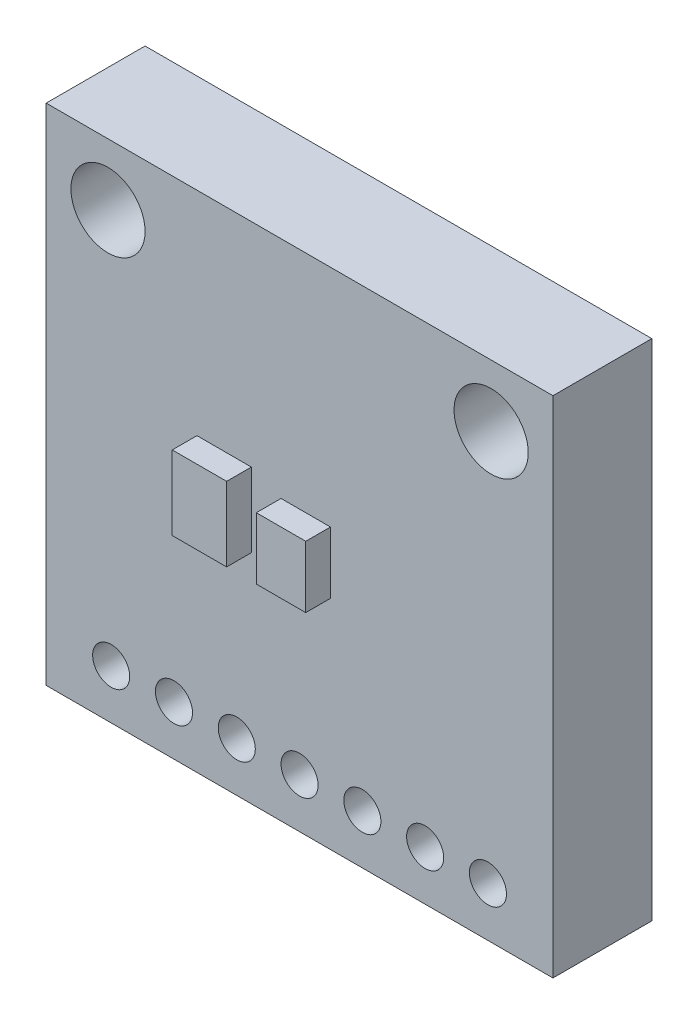
ISO-10303-21;
HEADER;
FILE_DESCRIPTION(('STEP AP214'),'2;1');
FILE_NAME('part.step','',(''),(''),'','','');
FILE_SCHEMA(('AUTOMOTIVE_DESIGN { 1 0 10303 214 1 1 1 1 }'));
ENDSEC;
DATA;
#1=APPLICATION_CONTEXT('core data for automotive mechanical design processes');
#2=APPLICATION_PROTOCOL_DEFINITION('international standard','automotive_design',2000,#1);
#3=PRODUCT_CONTEXT('',#1,'mechanical');
#4=PRODUCT('Part','Part','',(#3));
#5=PRODUCT_RELATED_PRODUCT_CATEGORY('part','',(#4));
#6=PRODUCT_DEFINITION_FORMATION('','',#4);
#7=PRODUCT_DEFINITION_CONTEXT('part definition',#1,'design');
#8=PRODUCT_DEFINITION('design','',#6,#7);
#9=PRODUCT_DEFINITION_SHAPE('','',#8);
#10=(LENGTH_UNIT() NAMED_UNIT(*) SI_UNIT(.MILLI.,.METRE.));
#11=(NAMED_UNIT(*) PLANE_ANGLE_UNIT() SI_UNIT($,.RADIAN.));
#12=(NAMED_UNIT(*) SI_UNIT($,.STERADIAN.) SOLID_ANGLE_UNIT());
#13=UNCERTAINTY_MEASURE_WITH_UNIT(LENGTH_MEASURE(1.E-05),#10,'distance_accuracy_value','');
#14=(GEOMETRIC_REPRESENTATION_CONTEXT(3) GLOBAL_UNCERTAINTY_ASSIGNED_CONTEXT((#13)) GLOBAL_UNIT_ASSIGNED_CONTEXT((#10,
#11,#12)) REPRESENTATION_CONTEXT('',''));
#15=CARTESIAN_POINT('',(0.,0.,0.));
#16=DIRECTION('',(0.,0.,1.));
#17=DIRECTION('',(1.,0.,0.));
#18=AXIS2_PLACEMENT_3D('',#15,#16,#17);
#19=CARTESIAN_POINT('',(0.,0.,0.));
#20=DIRECTION('',(0.,0.,-1.));
#21=DIRECTION('',(-1.,0.,0.));
#22=AXIS2_PLACEMENT_3D('',#19,#20,#21);
#23=PLANE('',#22);
#24=DIRECTION('',(0.,-1.,0.));
#25=VECTOR('',#24,1.);
#26=CARTESIAN_POINT('',(6.1,11.8,0.));
#27=LINE('',#26,#25);
#28=CARTESIAN_POINT('',(6.1,11.8,0.));
#29=VERTEX_POINT('',#28);
#30=CARTESIAN_POINT('',(6.1,8.8,0.));
#31=VERTEX_POINT('',#30);
#32=EDGE_CURVE('E144',#29,#31,#27,.T.);
#33=ORIENTED_EDGE('',*,*,#32,.F.);
#34=DIRECTION('',(-1.,0.,0.));
#35=VECTOR('',#34,1.);
#36=CARTESIAN_POINT('',(6.1,11.8,0.));
#37=LINE('',#36,#35);
#38=CARTESIAN_POINT('',(8.3,11.8,0.));
#39=VERTEX_POINT('',#38);
#40=EDGE_CURVE('E157',#39,#29,#37,.T.);
#41=ORIENTED_EDGE('',*,*,#40,.F.);
#42=DIRECTION('',(0.,1.,0.));
#43=VECTOR('',#42,1.);
#44=CARTESIAN_POINT('',(8.3,11.8,0.));
#45=LINE('',#44,#43);
#46=CARTESIAN_POINT('',(8.3,8.8,0.));
#47=VERTEX_POINT('',#46);
#48=EDGE_CURVE('E166',#47,#39,#45,.T.);
#49=ORIENTED_EDGE('',*,*,#48,.F.);
#50=DIRECTION('',(1.,0.,0.));
#51=VECTOR('',#50,1.);
#52=CARTESIAN_POINT('',(6.1,8.8,0.));
#53=LINE('',#52,#51);
#54=EDGE_CURVE('E147',#31,#47,#53,.T.);
#55=ORIENTED_EDGE('',*,*,#54,.F.);
#56=EDGE_LOOP('',(#33,#41,#49,#55));
#57=FACE_BOUND('',#56,.T.);
#58=CARTESIAN_POINT('',(17.87,2.,0.));
#59=DIRECTION('',(0.,0.,1.));
#60=DIRECTION('',(1.,0.,0.));
#61=AXIS2_PLACEMENT_3D('',#58,#59,#60);
#62=CIRCLE('',#61,0.750000000000002);
#63=CARTESIAN_POINT('',(18.62,2.,0.));
#64=VERTEX_POINT('',#63);
#65=EDGE_CURVE('E182',#64,#64,#62,.T.);
#66=ORIENTED_EDGE('',*,*,#65,.F.);
#67=EDGE_LOOP('',(#66));
#68=FACE_BOUND('',#67,.T.);
#69=CARTESIAN_POINT('',(15.33,2.,0.));
#70=DIRECTION('',(0.,0.,1.));
#71=DIRECTION('',(1.,0.,0.));
#72=AXIS2_PLACEMENT_3D('',#69,#70,#71);
#73=CIRCLE('',#72,0.750000000000004);
#74=CARTESIAN_POINT('',(16.08,2.,0.));
#75=VERTEX_POINT('',#74);
#76=EDGE_CURVE('E186',#75,#75,#73,.T.);
#77=ORIENTED_EDGE('',*,*,#76,.F.);
#78=EDGE_LOOP('',(#77));
#79=FACE_BOUND('',#78,.T.);
#80=CARTESIAN_POINT('',(12.79,2.,0.));
#81=DIRECTION('',(0.,0.,1.));
#82=DIRECTION('',(1.,0.,0.));
#83=AXIS2_PLACEMENT_3D('',#80,#81,#82);
#84=CIRCLE('',#83,0.75);
#85=CARTESIAN_POINT('',(13.54,2.,0.));
#86=VERTEX_POINT('',#85);
#87=EDGE_CURVE('E192',#86,#86,#84,.T.);
#88=ORIENTED_EDGE('',*,*,#87,.F.);
#89=EDGE_LOOP('',(#88));
#90=FACE_BOUND('',#89,.T.);
#91=CARTESIAN_POINT('',(10.25,2.,0.));
#92=DIRECTION('',(0.,0.,1.));
#93=DIRECTION('',(1.,0.,0.));
#94=AXIS2_PLACEMENT_3D('',#91,#92,#93);
#95=CIRCLE('',#94,0.75);
#96=CARTESIAN_POINT('',(11.,2.,0.));
#97=VERTEX_POINT('',#96);
#98=EDGE_CURVE('E198',#97,#97,#95,.T.);
#99=ORIENTED_EDGE('',*,*,#98,.F.);
#100=EDGE_LOOP('',(#99));
#101=FACE_BOUND('',#100,.T.);
#102=CARTESIAN_POINT('',(7.71,2.,0.));
#103=DIRECTION('',(0.,0.,1.));
#104=DIRECTION('',(1.,0.,0.));
#105=AXIS2_PLACEMENT_3D('',#102,#103,#104);
#106=CIRCLE('',#105,0.749999999999999);
#107=CARTESIAN_POINT('',(8.46,2.,0.));
#108=VERTEX_POINT('',#107);
#109=EDGE_CURVE('E204',#108,#108,#106,.T.);
#110=ORIENTED_EDGE('',*,*,#109,.F.);
#111=EDGE_LOOP('',(#110));
#112=FACE_BOUND('',#111,.T.);
#113=CARTESIAN_POINT('',(5.17,2.,0.));
#114=DIRECTION('',(0.,0.,1.));
#115=DIRECTION('',(1.,0.,0.));
#116=AXIS2_PLACEMENT_3D('',#113,#114,#115);
#117=CIRCLE('',#116,0.75);
#118=CARTESIAN_POINT('',(5.92000000000001,2.,0.));
#119=VERTEX_POINT('',#118);
#120=EDGE_CURVE('E210',#119,#119,#117,.T.);
#121=ORIENTED_EDGE('',*,*,#120,.F.);
#122=EDGE_LOOP('',(#121));
#123=FACE_BOUND('',#122,.T.);
#124=CARTESIAN_POINT('',(2.63,2.,0.));
#125=DIRECTION('',(0.,0.,1.));
#126=DIRECTION('',(1.,0.,0.));
#127=AXIS2_PLACEMENT_3D('',#124,#125,#126);
#128=CIRCLE('',#127,0.75);
#129=CARTESIAN_POINT('',(3.38,2.,0.));
#130=VERTEX_POINT('',#129);
#131=EDGE_CURVE('E216',#130,#130,#128,.T.);
#132=ORIENTED_EDGE('',*,*,#131,.F.);
#133=EDGE_LOOP('',(#132));
#134=FACE_BOUND('',#133,.T.);
#135=CARTESIAN_POINT('',(18.,17.9,0.));
#136=DIRECTION('',(0.,0.,1.));
#137=DIRECTION('',(1.,0.,0.));
#138=AXIS2_PLACEMENT_3D('',#135,#136,#137);
#139=CIRCLE('',#138,1.5);
#140=CARTESIAN_POINT('',(19.5,17.9,0.));
#141=VERTEX_POINT('',#140);
#142=EDGE_CURVE('E222',#141,#141,#139,.T.);
#143=ORIENTED_EDGE('',*,*,#142,.F.);
#144=EDGE_LOOP('',(#143));
#145=FACE_BOUND('',#144,.T.);
#146=CARTESIAN_POINT('',(2.5,17.9,0.));
#147=DIRECTION('',(0.,0.,1.));
#148=DIRECTION('',(1.,0.,0.));
#149=AXIS2_PLACEMENT_3D('',#146,#147,#148);
#150=CIRCLE('',#149,1.5);
#151=CARTESIAN_POINT('',(4.,17.9,0.));
#152=VERTEX_POINT('',#151);
#153=EDGE_CURVE('E228',#152,#152,#150,.T.);
#154=ORIENTED_EDGE('',*,*,#153,.F.);
#155=EDGE_LOOP('',(#154));
#156=FACE_BOUND('',#155,.T.);
#157=DIRECTION('',(0.,-1.,0.));
#158=VECTOR('',#157,1.);
#159=CARTESIAN_POINT('',(0.,0.,0.));
#160=LINE('',#159,#158);
#161=CARTESIAN_POINT('',(0.,20.4,0.));
#162=VERTEX_POINT('',#161);
#163=CARTESIAN_POINT('',(0.,0.,0.));
#164=VERTEX_POINT('',#163);
#165=EDGE_CURVE('E234',#162,#164,#160,.T.);
#166=ORIENTED_EDGE('',*,*,#165,.T.);
#167=DIRECTION('',(1.,0.,0.));
#168=VECTOR('',#167,1.);
#169=CARTESIAN_POINT('',(0.,0.,0.));
#170=LINE('',#169,#168);
#171=CARTESIAN_POINT('',(20.5,0.,0.));
#172=VERTEX_POINT('',#171);
#173=EDGE_CURVE('E252',#164,#172,#170,.T.);
#174=ORIENTED_EDGE('',*,*,#173,.T.);
#175=DIRECTION('',(0.,1.,0.));
#176=VECTOR('',#175,1.);
#177=CARTESIAN_POINT('',(20.5,0.,0.));
#178=LINE('',#177,#176);
#179=CARTESIAN_POINT('',(20.5,20.4,0.));
#180=VERTEX_POINT('',#179);
#181=EDGE_CURVE('E255',#172,#180,#178,.T.);
#182=ORIENTED_EDGE('',*,*,#181,.T.);
#183=DIRECTION('',(-1.,0.,0.));
#184=VECTOR('',#183,1.);
#185=CARTESIAN_POINT('',(0.,20.4,0.));
#186=LINE('',#185,#184);
#187=EDGE_CURVE('E241',#180,#162,#186,.T.);
#188=ORIENTED_EDGE('',*,*,#187,.T.);
#189=EDGE_LOOP('',(#166,#174,#182,#188));
#190=FACE_BOUND('',#189,.T.);
#191=DIRECTION('',(0.,-1.,0.));
#192=VECTOR('',#191,1.);
#193=CARTESIAN_POINT('',(9.5,11.3,0.));
#194=LINE('',#193,#192);
#195=CARTESIAN_POINT('',(9.5,11.3,0.));
#196=VERTEX_POINT('',#195);
#197=CARTESIAN_POINT('',(9.5,8.8,0.));
#198=VERTEX_POINT('',#197);
#199=EDGE_CURVE('E143',#196,#198,#194,.T.);
#200=ORIENTED_EDGE('',*,*,#199,.F.);
#201=DIRECTION('',(-1.,0.,0.));
#202=VECTOR('',#201,1.);
#203=CARTESIAN_POINT('',(9.5,11.3,0.));
#204=LINE('',#203,#202);
#205=CARTESIAN_POINT('',(11.5,11.3,0.));
#206=VERTEX_POINT('',#205);
#207=EDGE_CURVE('E140',#206,#196,#204,.T.);
#208=ORIENTED_EDGE('',*,*,#207,.F.);
#209=DIRECTION('',(0.,1.,0.));
#210=VECTOR('',#209,1.);
#211=CARTESIAN_POINT('',(11.5,11.3,0.));
#212=LINE('',#211,#210);
#213=CARTESIAN_POINT('',(11.5,8.8,0.));
#214=VERTEX_POINT('',#213);
#215=EDGE_CURVE('E55',#214,#206,#212,.T.);
#216=ORIENTED_EDGE('',*,*,#215,.F.);
#217=DIRECTION('',(1.,0.,0.));
#218=VECTOR('',#217,1.);
#219=CARTESIAN_POINT('',(9.5,8.8,0.));
#220=LINE('',#219,#218);
#221=EDGE_CURVE('E50',#198,#214,#220,.T.);
#222=ORIENTED_EDGE('',*,*,#221,.F.);
#223=EDGE_LOOP('',(#200,#208,#216,#222));
#224=FACE_BOUND('',#223,.T.);
#225=ADVANCED_FACE('F33',(#57,#68,#79,#90,#101,#112,#123,#134,#145,#156,#190,#224),#23,.F.);
#226=CARTESIAN_POINT('',(0.,0.,-4.));
#227=DIRECTION('',(-1.,0.,0.));
#228=DIRECTION('',(0.,0.,1.));
#229=AXIS2_PLACEMENT_3D('',#226,#227,#228);
#230=PLANE('',#229);
#231=ORIENTED_EDGE('',*,*,#165,.F.);
#232=DIRECTION('',(0.,0.,1.));
#233=VECTOR('',#232,1.);
#234=CARTESIAN_POINT('',(0.,20.4,-4.));
#235=LINE('',#234,#233);
#236=CARTESIAN_POINT('',(0.,20.4,-4.));
#237=VERTEX_POINT('',#236);
#238=EDGE_CURVE('E11',#237,#162,#235,.T.);
#239=ORIENTED_EDGE('',*,*,#238,.F.);
#240=DIRECTION('',(0.,-1.,0.));
#241=VECTOR('',#240,1.);
#242=CARTESIAN_POINT('',(0.,0.,-4.));
#243=LINE('',#242,#241);
#244=CARTESIAN_POINT('',(0.,0.,-4.));
#245=VERTEX_POINT('',#244);
#246=EDGE_CURVE('E237',#237,#245,#243,.T.);
#247=ORIENTED_EDGE('',*,*,#246,.T.);
#248=DIRECTION('',(0.,0.,1.));
#249=VECTOR('',#248,1.);
#250=CARTESIAN_POINT('',(0.,0.,-4.));
#251=LINE('',#250,#249);
#252=EDGE_CURVE('E37',#245,#164,#251,.T.);
#253=ORIENTED_EDGE('',*,*,#252,.T.);
#254=EDGE_LOOP('',(#231,#239,#247,#253));
#255=FACE_BOUND('',#254,.T.);
#256=ADVANCED_FACE('F35',(#255),#230,.T.);
#257=CARTESIAN_POINT('',(0.,20.4,-4.));
#258=DIRECTION('',(0.,1.,0.));
#259=DIRECTION('',(0.,0.,1.));
#260=AXIS2_PLACEMENT_3D('',#257,#258,#259);
#261=PLANE('',#260);
#262=ORIENTED_EDGE('',*,*,#187,.F.);
#263=DIRECTION('',(0.,0.,1.));
#264=VECTOR('',#263,1.);
#265=CARTESIAN_POINT('',(20.5,20.4,-4.));
#266=LINE('',#265,#264);
#267=CARTESIAN_POINT('',(20.5,20.4,-4.));
#268=VERTEX_POINT('',#267);
#269=EDGE_CURVE('E42',#268,#180,#266,.T.);
#270=ORIENTED_EDGE('',*,*,#269,.F.);
#271=DIRECTION('',(-1.,0.,0.));
#272=VECTOR('',#271,1.);
#273=CARTESIAN_POINT('',(0.,20.4,-4.));
#274=LINE('',#273,#272);
#275=EDGE_CURVE('E247',#268,#237,#274,.T.);
#276=ORIENTED_EDGE('',*,*,#275,.T.);
#277=ORIENTED_EDGE('',*,*,#238,.T.);
#278=EDGE_LOOP('',(#262,#270,#276,#277));
#279=FACE_BOUND('',#278,.T.);
#280=ADVANCED_FACE('F272',(#279),#261,.T.);
#281=CARTESIAN_POINT('',(20.5,0.,-4.));
#282=DIRECTION('',(1.,0.,0.));
#283=DIRECTION('',(0.,0.,-1.));
#284=AXIS2_PLACEMENT_3D('',#281,#282,#283);
#285=PLANE('',#284);
#286=ORIENTED_EDGE('',*,*,#181,.F.);
#287=DIRECTION('',(0.,0.,1.));
#288=VECTOR('',#287,1.);
#289=CARTESIAN_POINT('',(20.5,0.,-4.));
#290=LINE('',#289,#288);
#291=CARTESIAN_POINT('',(20.5,0.,-4.));
#292=VERTEX_POINT('',#291);
#293=EDGE_CURVE('E260',#292,#172,#290,.T.);
#294=ORIENTED_EDGE('',*,*,#293,.F.);
#295=DIRECTION('',(0.,1.,0.));
#296=VECTOR('',#295,1.);
#297=CARTESIAN_POINT('',(20.5,0.,-4.));
#298=LINE('',#297,#296);
#299=EDGE_CURVE('E244',#292,#268,#298,.T.);
#300=ORIENTED_EDGE('',*,*,#299,.T.);
#301=ORIENTED_EDGE('',*,*,#269,.T.);
#302=EDGE_LOOP('',(#286,#294,#300,#301));
#303=FACE_BOUND('',#302,.T.);
#304=ADVANCED_FACE('F278',(#303),#285,.T.);
#305=CARTESIAN_POINT('',(0.,0.,-4.));
#306=DIRECTION('',(0.,-1.,0.));
#307=DIRECTION('',(0.,0.,-1.));
#308=AXIS2_PLACEMENT_3D('',#305,#306,#307);
#309=PLANE('',#308);
#310=ORIENTED_EDGE('',*,*,#173,.F.);
#311=ORIENTED_EDGE('',*,*,#252,.F.);
#312=DIRECTION('',(1.,0.,0.));
#313=VECTOR('',#312,1.);
#314=CARTESIAN_POINT('',(0.,0.,-4.));
#315=LINE('',#314,#313);
#316=EDGE_CURVE('E240',#245,#292,#315,.T.);
#317=ORIENTED_EDGE('',*,*,#316,.T.);
#318=ORIENTED_EDGE('',*,*,#293,.T.);
#319=EDGE_LOOP('',(#310,#311,#317,#318));
#320=FACE_BOUND('',#319,.T.);
#321=ADVANCED_FACE('F268',(#320),#309,.T.);
#322=CARTESIAN_POINT('',(0.,0.,-4.));
#323=DIRECTION('',(0.,0.,-1.));
#324=DIRECTION('',(-1.,0.,0.));
#325=AXIS2_PLACEMENT_3D('',#322,#323,#324);
#326=PLANE('',#325);
#327=CARTESIAN_POINT('',(17.87,2.,-4.));
#328=DIRECTION('',(0.,0.,1.));
#329=DIRECTION('',(1.,0.,0.));
#330=AXIS2_PLACEMENT_3D('',#327,#328,#329);
#331=CIRCLE('',#330,0.750000000000002);
#332=CARTESIAN_POINT('',(18.62,2.,-4.));
#333=VERTEX_POINT('',#332);
#334=EDGE_CURVE('E183',#333,#333,#331,.T.);
#335=ORIENTED_EDGE('',*,*,#334,.T.);
#336=EDGE_LOOP('',(#335));
#337=FACE_BOUND('',#336,.T.);
#338=CARTESIAN_POINT('',(15.33,2.,-4.));
#339=DIRECTION('',(0.,0.,1.));
#340=DIRECTION('',(1.,0.,0.));
#341=AXIS2_PLACEMENT_3D('',#338,#339,#340);
#342=CIRCLE('',#341,0.750000000000004);
#343=CARTESIAN_POINT('',(16.08,2.,-4.));
#344=VERTEX_POINT('',#343);
#345=EDGE_CURVE('E189',#344,#344,#342,.T.);
#346=ORIENTED_EDGE('',*,*,#345,.T.);
#347=EDGE_LOOP('',(#346));
#348=FACE_BOUND('',#347,.T.);
#349=CARTESIAN_POINT('',(12.79,2.,-4.));
#350=DIRECTION('',(0.,0.,1.));
#351=DIRECTION('',(1.,0.,0.));
#352=AXIS2_PLACEMENT_3D('',#349,#350,#351);
#353=CIRCLE('',#352,0.75);
#354=CARTESIAN_POINT('',(13.54,2.,-4.));
#355=VERTEX_POINT('',#354);
#356=EDGE_CURVE('E195',#355,#355,#353,.T.);
#357=ORIENTED_EDGE('',*,*,#356,.T.);
#358=EDGE_LOOP('',(#357));
#359=FACE_BOUND('',#358,.T.);
#360=CARTESIAN_POINT('',(10.25,2.,-4.));
#361=DIRECTION('',(0.,0.,1.));
#362=DIRECTION('',(1.,0.,0.));
#363=AXIS2_PLACEMENT_3D('',#360,#361,#362);
#364=CIRCLE('',#363,0.75);
#365=CARTESIAN_POINT('',(11.,2.,-4.));
#366=VERTEX_POINT('',#365);
#367=EDGE_CURVE('E201',#366,#366,#364,.T.);
#368=ORIENTED_EDGE('',*,*,#367,.T.);
#369=EDGE_LOOP('',(#368));
#370=FACE_BOUND('',#369,.T.);
#371=CARTESIAN_POINT('',(7.71,2.,-4.));
#372=DIRECTION('',(0.,0.,1.));
#373=DIRECTION('',(1.,0.,0.));
#374=AXIS2_PLACEMENT_3D('',#371,#372,#373);
#375=CIRCLE('',#374,0.749999999999999);
#376=CARTESIAN_POINT('',(8.46,2.,-4.));
#377=VERTEX_POINT('',#376);
#378=EDGE_CURVE('E207',#377,#377,#375,.T.);
#379=ORIENTED_EDGE('',*,*,#378,.T.);
#380=EDGE_LOOP('',(#379));
#381=FACE_BOUND('',#380,.T.);
#382=CARTESIAN_POINT('',(5.17,2.,-4.));
#383=DIRECTION('',(0.,0.,1.));
#384=DIRECTION('',(1.,0.,0.));
#385=AXIS2_PLACEMENT_3D('',#382,#383,#384);
#386=CIRCLE('',#385,0.75);
#387=CARTESIAN_POINT('',(5.92000000000001,2.,-4.));
#388=VERTEX_POINT('',#387);
#389=EDGE_CURVE('E213',#388,#388,#386,.T.);
#390=ORIENTED_EDGE('',*,*,#389,.T.);
#391=EDGE_LOOP('',(#390));
#392=FACE_BOUND('',#391,.T.);
#393=CARTESIAN_POINT('',(2.63,2.,-4.));
#394=DIRECTION('',(0.,0.,1.));
#395=DIRECTION('',(1.,0.,0.));
#396=AXIS2_PLACEMENT_3D('',#393,#394,#395);
#397=CIRCLE('',#396,0.75);
#398=CARTESIAN_POINT('',(3.38,2.,-4.));
#399=VERTEX_POINT('',#398);
#400=EDGE_CURVE('E219',#399,#399,#397,.T.);
#401=ORIENTED_EDGE('',*,*,#400,.T.);
#402=EDGE_LOOP('',(#401));
#403=FACE_BOUND('',#402,.T.);
#404=CARTESIAN_POINT('',(18.,17.9,-4.));
#405=DIRECTION('',(0.,0.,1.));
#406=DIRECTION('',(1.,0.,0.));
#407=AXIS2_PLACEMENT_3D('',#404,#405,#406);
#408=CIRCLE('',#407,1.5);
#409=CARTESIAN_POINT('',(19.5,17.9,-4.));
#410=VERTEX_POINT('',#409);
#411=EDGE_CURVE('E225',#410,#410,#408,.T.);
#412=ORIENTED_EDGE('',*,*,#411,.T.);
#413=EDGE_LOOP('',(#412));
#414=FACE_BOUND('',#413,.T.);
#415=CARTESIAN_POINT('',(2.5,17.9,-4.));
#416=DIRECTION('',(0.,0.,1.));
#417=DIRECTION('',(1.,0.,0.));
#418=AXIS2_PLACEMENT_3D('',#415,#416,#417);
#419=CIRCLE('',#418,1.5);
#420=CARTESIAN_POINT('',(4.,17.9,-4.));
#421=VERTEX_POINT('',#420);
#422=EDGE_CURVE('E231',#421,#421,#419,.T.);
#423=ORIENTED_EDGE('',*,*,#422,.T.);
#424=EDGE_LOOP('',(#423));
#425=FACE_BOUND('',#424,.T.);
#426=ORIENTED_EDGE('',*,*,#246,.F.);
#427=ORIENTED_EDGE('',*,*,#275,.F.);
#428=ORIENTED_EDGE('',*,*,#299,.F.);
#429=ORIENTED_EDGE('',*,*,#316,.F.);
#430=EDGE_LOOP('',(#426,#427,#428,#429));
#431=FACE_BOUND('',#430,.T.);
#432=ADVANCED_FACE('F275',(#337,#348,#359,#370,#381,#392,#403,#414,#425,#431),#326,.T.);
#433=CARTESIAN_POINT('',(2.5,17.9,-4.));
#434=DIRECTION('',(0.,0.,1.));
#435=DIRECTION('',(1.,0.,0.));
#436=AXIS2_PLACEMENT_3D('',#433,#434,#435);
#437=CYLINDRICAL_SURFACE('',#436,1.5);
#438=ORIENTED_EDGE('',*,*,#422,.F.);
#439=EDGE_LOOP('',(#438));
#440=FACE_BOUND('',#439,.T.);
#441=ORIENTED_EDGE('',*,*,#153,.T.);
#442=EDGE_LOOP('',(#441));
#443=FACE_BOUND('',#442,.T.);
#444=ADVANCED_FACE('F298',(#440,#443),#437,.F.);
#445=CARTESIAN_POINT('',(18.,17.9,-4.));
#446=DIRECTION('',(0.,0.,1.));
#447=DIRECTION('',(1.,0.,0.));
#448=AXIS2_PLACEMENT_3D('',#445,#446,#447);
#449=CYLINDRICAL_SURFACE('',#448,1.5);
#450=ORIENTED_EDGE('',*,*,#411,.F.);
#451=EDGE_LOOP('',(#450));
#452=FACE_BOUND('',#451,.T.);
#453=ORIENTED_EDGE('',*,*,#142,.T.);
#454=EDGE_LOOP('',(#453));
#455=FACE_BOUND('',#454,.T.);
#456=ADVANCED_FACE('F302',(#452,#455),#449,.F.);
#457=CARTESIAN_POINT('',(2.63,2.,-4.));
#458=DIRECTION('',(0.,0.,1.));
#459=DIRECTION('',(1.,0.,0.));
#460=AXIS2_PLACEMENT_3D('',#457,#458,#459);
#461=CYLINDRICAL_SURFACE('',#460,0.75);
#462=ORIENTED_EDGE('',*,*,#400,.F.);
#463=EDGE_LOOP('',(#462));
#464=FACE_BOUND('',#463,.T.);
#465=ORIENTED_EDGE('',*,*,#131,.T.);
#466=EDGE_LOOP('',(#465));
#467=FACE_BOUND('',#466,.T.);
#468=ADVANCED_FACE('F306',(#464,#467),#461,.F.);
#469=CARTESIAN_POINT('',(5.17,2.,-4.));
#470=DIRECTION('',(0.,0.,1.));
#471=DIRECTION('',(1.,0.,0.));
#472=AXIS2_PLACEMENT_3D('',#469,#470,#471);
#473=CYLINDRICAL_SURFACE('',#472,0.75);
#474=ORIENTED_EDGE('',*,*,#389,.F.);
#475=EDGE_LOOP('',(#474));
#476=FACE_BOUND('',#475,.T.);
#477=ORIENTED_EDGE('',*,*,#120,.T.);
#478=EDGE_LOOP('',(#477));
#479=FACE_BOUND('',#478,.T.);
#480=ADVANCED_FACE('F310',(#476,#479),#473,.F.);
#481=CARTESIAN_POINT('',(7.71,2.,-4.));
#482=DIRECTION('',(0.,0.,1.));
#483=DIRECTION('',(1.,0.,0.));
#484=AXIS2_PLACEMENT_3D('',#481,#482,#483);
#485=CYLINDRICAL_SURFACE('',#484,0.749999999999999);
#486=ORIENTED_EDGE('',*,*,#378,.F.);
#487=EDGE_LOOP('',(#486));
#488=FACE_BOUND('',#487,.T.);
#489=ORIENTED_EDGE('',*,*,#109,.T.);
#490=EDGE_LOOP('',(#489));
#491=FACE_BOUND('',#490,.T.);
#492=ADVANCED_FACE('F314',(#488,#491),#485,.F.);
#493=CARTESIAN_POINT('',(10.25,2.,-4.));
#494=DIRECTION('',(0.,0.,1.));
#495=DIRECTION('',(1.,0.,0.));
#496=AXIS2_PLACEMENT_3D('',#493,#494,#495);
#497=CYLINDRICAL_SURFACE('',#496,0.75);
#498=ORIENTED_EDGE('',*,*,#367,.F.);
#499=EDGE_LOOP('',(#498));
#500=FACE_BOUND('',#499,.T.);
#501=ORIENTED_EDGE('',*,*,#98,.T.);
#502=EDGE_LOOP('',(#501));
#503=FACE_BOUND('',#502,.T.);
#504=ADVANCED_FACE('F318',(#500,#503),#497,.F.);
#505=CARTESIAN_POINT('',(12.79,2.,-4.));
#506=DIRECTION('',(0.,0.,1.));
#507=DIRECTION('',(1.,0.,0.));
#508=AXIS2_PLACEMENT_3D('',#505,#506,#507);
#509=CYLINDRICAL_SURFACE('',#508,0.75);
#510=ORIENTED_EDGE('',*,*,#356,.F.);
#511=EDGE_LOOP('',(#510));
#512=FACE_BOUND('',#511,.T.);
#513=ORIENTED_EDGE('',*,*,#87,.T.);
#514=EDGE_LOOP('',(#513));
#515=FACE_BOUND('',#514,.T.);
#516=ADVANCED_FACE('F322',(#512,#515),#509,.F.);
#517=CARTESIAN_POINT('',(15.33,2.,-4.));
#518=DIRECTION('',(0.,0.,1.));
#519=DIRECTION('',(1.,0.,0.));
#520=AXIS2_PLACEMENT_3D('',#517,#518,#519);
#521=CYLINDRICAL_SURFACE('',#520,0.750000000000004);
#522=ORIENTED_EDGE('',*,*,#345,.F.);
#523=EDGE_LOOP('',(#522));
#524=FACE_BOUND('',#523,.T.);
#525=ORIENTED_EDGE('',*,*,#76,.T.);
#526=EDGE_LOOP('',(#525));
#527=FACE_BOUND('',#526,.T.);
#528=ADVANCED_FACE('F326',(#524,#527),#521,.F.);
#529=CARTESIAN_POINT('',(17.87,2.,-4.));
#530=DIRECTION('',(0.,0.,1.));
#531=DIRECTION('',(1.,0.,0.));
#532=AXIS2_PLACEMENT_3D('',#529,#530,#531);
#533=CYLINDRICAL_SURFACE('',#532,0.750000000000002);
#534=ORIENTED_EDGE('',*,*,#334,.F.);
#535=EDGE_LOOP('',(#534));
#536=FACE_BOUND('',#535,.T.);
#537=ORIENTED_EDGE('',*,*,#65,.T.);
#538=EDGE_LOOP('',(#537));
#539=FACE_BOUND('',#538,.T.);
#540=ADVANCED_FACE('F330',(#536,#539),#533,.F.);
#541=CARTESIAN_POINT('',(6.1,11.8,1.));
#542=DIRECTION('',(1.,0.,0.));
#543=DIRECTION('',(0.,0.,-1.));
#544=AXIS2_PLACEMENT_3D('',#541,#542,#543);
#545=PLANE('',#544);
#546=ORIENTED_EDGE('',*,*,#32,.T.);
#547=DIRECTION('',(0.,0.,-1.));
#548=VECTOR('',#547,1.);
#549=CARTESIAN_POINT('',(6.1,8.8,1.));
#550=LINE('',#549,#548);
#551=CARTESIAN_POINT('',(6.1,8.8,1.));
#552=VERTEX_POINT('',#551);
#553=EDGE_CURVE('E179',#552,#31,#550,.T.);
#554=ORIENTED_EDGE('',*,*,#553,.F.);
#555=DIRECTION('',(0.,-1.,0.));
#556=VECTOR('',#555,1.);
#557=CARTESIAN_POINT('',(6.1,11.8,1.));
#558=LINE('',#557,#556);
#559=CARTESIAN_POINT('',(6.1,11.8,1.));
#560=VERTEX_POINT('',#559);
#561=EDGE_CURVE('E153',#560,#552,#558,.T.);
#562=ORIENTED_EDGE('',*,*,#561,.F.);
#563=DIRECTION('',(0.,0.,-1.));
#564=VECTOR('',#563,1.);
#565=CARTESIAN_POINT('',(6.1,11.8,1.));
#566=LINE('',#565,#564);
#567=EDGE_CURVE('E162',#560,#29,#566,.T.);
#568=ORIENTED_EDGE('',*,*,#567,.T.);
#569=EDGE_LOOP('',(#546,#554,#562,#568));
#570=FACE_BOUND('',#569,.T.);
#571=ADVANCED_FACE('F334',(#570),#545,.F.);
#572=CARTESIAN_POINT('',(6.1,8.8,1.));
#573=DIRECTION('',(0.,1.,0.));
#574=DIRECTION('',(0.,0.,1.));
#575=AXIS2_PLACEMENT_3D('',#572,#573,#574);
#576=PLANE('',#575);
#577=ORIENTED_EDGE('',*,*,#54,.T.);
#578=DIRECTION('',(0.,0.,-1.));
#579=VECTOR('',#578,1.);
#580=CARTESIAN_POINT('',(8.3,8.8,1.));
#581=LINE('',#580,#579);
#582=CARTESIAN_POINT('',(8.3,8.8,1.));
#583=VERTEX_POINT('',#582);
#584=EDGE_CURVE('E176',#583,#47,#581,.T.);
#585=ORIENTED_EDGE('',*,*,#584,.F.);
#586=DIRECTION('',(1.,0.,0.));
#587=VECTOR('',#586,1.);
#588=CARTESIAN_POINT('',(6.1,8.8,1.));
#589=LINE('',#588,#587);
#590=EDGE_CURVE('E156',#552,#583,#589,.T.);
#591=ORIENTED_EDGE('',*,*,#590,.F.);
#592=ORIENTED_EDGE('',*,*,#553,.T.);
#593=EDGE_LOOP('',(#577,#585,#591,#592));
#594=FACE_BOUND('',#593,.T.);
#595=ADVANCED_FACE('F338',(#594),#576,.F.);
#596=CARTESIAN_POINT('',(8.3,11.8,1.));
#597=DIRECTION('',(-1.,0.,0.));
#598=DIRECTION('',(0.,0.,1.));
#599=AXIS2_PLACEMENT_3D('',#596,#597,#598);
#600=PLANE('',#599);
#601=ORIENTED_EDGE('',*,*,#48,.T.);
#602=DIRECTION('',(0.,0.,-1.));
#603=VECTOR('',#602,1.);
#604=CARTESIAN_POINT('',(8.3,11.8,1.));
#605=LINE('',#604,#603);
#606=CARTESIAN_POINT('',(8.3,11.8,1.));
#607=VERTEX_POINT('',#606);
#608=EDGE_CURVE('E173',#607,#39,#605,.T.);
#609=ORIENTED_EDGE('',*,*,#608,.F.);
#610=DIRECTION('',(0.,1.,0.));
#611=VECTOR('',#610,1.);
#612=CARTESIAN_POINT('',(8.3,11.8,1.));
#613=LINE('',#612,#611);
#614=EDGE_CURVE('E159',#583,#607,#613,.T.);
#615=ORIENTED_EDGE('',*,*,#614,.F.);
#616=ORIENTED_EDGE('',*,*,#584,.T.);
#617=EDGE_LOOP('',(#601,#609,#615,#616));
#618=FACE_BOUND('',#617,.T.);
#619=ADVANCED_FACE('F342',(#618),#600,.F.);
#620=CARTESIAN_POINT('',(6.1,11.8,1.));
#621=DIRECTION('',(0.,-1.,0.));
#622=DIRECTION('',(1.,0.,0.));
#623=AXIS2_PLACEMENT_3D('',#620,#621,#622);
#624=PLANE('',#623);
#625=ORIENTED_EDGE('',*,*,#40,.T.);
#626=ORIENTED_EDGE('',*,*,#567,.F.);
#627=DIRECTION('',(-1.,0.,0.));
#628=VECTOR('',#627,1.);
#629=CARTESIAN_POINT('',(6.1,11.8,1.));
#630=LINE('',#629,#628);
#631=EDGE_CURVE('E161',#607,#560,#630,.T.);
#632=ORIENTED_EDGE('',*,*,#631,.F.);
#633=ORIENTED_EDGE('',*,*,#608,.T.);
#634=EDGE_LOOP('',(#625,#626,#632,#633));
#635=FACE_BOUND('',#634,.T.);
#636=ADVANCED_FACE('F346',(#635),#624,.F.);
#637=CARTESIAN_POINT('',(0.,0.,1.));
#638=DIRECTION('',(0.,0.,1.));
#639=DIRECTION('',(1.,0.,0.));
#640=AXIS2_PLACEMENT_3D('',#637,#638,#639);
#641=PLANE('',#640);
#642=ORIENTED_EDGE('',*,*,#561,.T.);
#643=ORIENTED_EDGE('',*,*,#590,.T.);
#644=ORIENTED_EDGE('',*,*,#614,.T.);
#645=ORIENTED_EDGE('',*,*,#631,.T.);
#646=EDGE_LOOP('',(#642,#643,#644,#645));
#647=FACE_BOUND('',#646,.T.);
#648=ADVANCED_FACE('F350',(#647),#641,.T.);
#649=CARTESIAN_POINT('',(9.5,11.3,1.));
#650=DIRECTION('',(1.,0.,0.));
#651=DIRECTION('',(0.,0.,-1.));
#652=AXIS2_PLACEMENT_3D('',#649,#650,#651);
#653=PLANE('',#652);
#654=ORIENTED_EDGE('',*,*,#199,.T.);
#655=DIRECTION('',(0.,0.,-1.));
#656=VECTOR('',#655,1.);
#657=CARTESIAN_POINT('',(9.5,8.8,1.));
#658=LINE('',#657,#656);
#659=CARTESIAN_POINT('',(9.5,8.8,1.));
#660=VERTEX_POINT('',#659);
#661=EDGE_CURVE('E124',#660,#198,#658,.T.);
#662=ORIENTED_EDGE('',*,*,#661,.F.);
#663=DIRECTION('',(0.,-1.,0.));
#664=VECTOR('',#663,1.);
#665=CARTESIAN_POINT('',(9.5,11.3,1.));
#666=LINE('',#665,#664);
#667=CARTESIAN_POINT('',(9.5,11.3,1.));
#668=VERTEX_POINT('',#667);
#669=EDGE_CURVE('E131',#668,#660,#666,.T.);
#670=ORIENTED_EDGE('',*,*,#669,.F.);
#671=DIRECTION('',(0.,0.,-1.));
#672=VECTOR('',#671,1.);
#673=CARTESIAN_POINT('',(9.5,11.3,1.));
#674=LINE('',#673,#672);
#675=EDGE_CURVE('E514',#668,#196,#674,.T.);
#676=ORIENTED_EDGE('',*,*,#675,.T.);
#677=EDGE_LOOP('',(#654,#662,#670,#676));
#678=FACE_BOUND('',#677,.T.);
#679=ADVANCED_FACE('F142',(#678),#653,.F.);
#680=CARTESIAN_POINT('',(9.5,8.8,1.));
#681=DIRECTION('',(0.,1.,0.));
#682=DIRECTION('',(0.,0.,1.));
#683=AXIS2_PLACEMENT_3D('',#680,#681,#682);
#684=PLANE('',#683);
#685=ORIENTED_EDGE('',*,*,#221,.T.);
#686=DIRECTION('',(0.,0.,-1.));
#687=VECTOR('',#686,1.);
#688=CARTESIAN_POINT('',(11.5,8.8,1.));
#689=LINE('',#688,#687);
#690=CARTESIAN_POINT('',(11.5,8.8,1.));
#691=VERTEX_POINT('',#690);
#692=EDGE_CURVE('E127',#691,#214,#689,.T.);
#693=ORIENTED_EDGE('',*,*,#692,.F.);
#694=DIRECTION('',(1.,0.,0.));
#695=VECTOR('',#694,1.);
#696=CARTESIAN_POINT('',(9.5,8.8,1.));
#697=LINE('',#696,#695);
#698=EDGE_CURVE('E120',#660,#691,#697,.T.);
#699=ORIENTED_EDGE('',*,*,#698,.F.);
#700=ORIENTED_EDGE('',*,*,#661,.T.);
#701=EDGE_LOOP('',(#685,#693,#699,#700));
#702=FACE_BOUND('',#701,.T.);
#703=ADVANCED_FACE('F122',(#702),#684,.F.);
#704=CARTESIAN_POINT('',(11.5,11.3,1.));
#705=DIRECTION('',(-1.,0.,0.));
#706=DIRECTION('',(0.,0.,1.));
#707=AXIS2_PLACEMENT_3D('',#704,#705,#706);
#708=PLANE('',#707);
#709=ORIENTED_EDGE('',*,*,#215,.T.);
#710=DIRECTION('',(0.,0.,-1.));
#711=VECTOR('',#710,1.);
#712=CARTESIAN_POINT('',(11.5,11.3,1.));
#713=LINE('',#712,#711);
#714=CARTESIAN_POINT('',(11.5,11.3,1.));
#715=VERTEX_POINT('',#714);
#716=EDGE_CURVE('E149',#715,#206,#713,.T.);
#717=ORIENTED_EDGE('',*,*,#716,.F.);
#718=DIRECTION('',(0.,1.,0.));
#719=VECTOR('',#718,1.);
#720=CARTESIAN_POINT('',(11.5,11.3,1.));
#721=LINE('',#720,#719);
#722=EDGE_CURVE('E130',#691,#715,#721,.T.);
#723=ORIENTED_EDGE('',*,*,#722,.F.);
#724=ORIENTED_EDGE('',*,*,#692,.T.);
#725=EDGE_LOOP('',(#709,#717,#723,#724));
#726=FACE_BOUND('',#725,.T.);
#727=ADVANCED_FACE('F359',(#726),#708,.F.);
#728=CARTESIAN_POINT('',(9.5,11.3,1.));
#729=DIRECTION('',(0.,-1.,0.));
#730=DIRECTION('',(0.,0.,-1.));
#731=AXIS2_PLACEMENT_3D('',#728,#729,#730);
#732=PLANE('',#731);
#733=ORIENTED_EDGE('',*,*,#207,.T.);
#734=ORIENTED_EDGE('',*,*,#675,.F.);
#735=DIRECTION('',(-1.,0.,0.));
#736=VECTOR('',#735,1.);
#737=CARTESIAN_POINT('',(9.5,11.3,1.));
#738=LINE('',#737,#736);
#739=EDGE_CURVE('E136',#715,#668,#738,.T.);
#740=ORIENTED_EDGE('',*,*,#739,.F.);
#741=ORIENTED_EDGE('',*,*,#716,.T.);
#742=EDGE_LOOP('',(#733,#734,#740,#741));
#743=FACE_BOUND('',#742,.T.);
#744=ADVANCED_FACE('F362',(#743),#732,.F.);
#745=CARTESIAN_POINT('',(0.,0.,1.));
#746=DIRECTION('',(0.,0.,1.));
#747=DIRECTION('',(1.,0.,0.));
#748=AXIS2_PLACEMENT_3D('',#745,#746,#747);
#749=PLANE('',#748);
#750=ORIENTED_EDGE('',*,*,#669,.T.);
#751=ORIENTED_EDGE('',*,*,#698,.T.);
#752=ORIENTED_EDGE('',*,*,#722,.T.);
#753=ORIENTED_EDGE('',*,*,#739,.T.);
#754=EDGE_LOOP('',(#750,#751,#752,#753));
#755=FACE_BOUND('',#754,.T.);
#756=ADVANCED_FACE('F134',(#755),#749,.T.);
#757=CLOSED_SHELL('',(#225,#256,#280,#304,#321,#432,#444,#456,#468,#480,#492,#504,#516,#528,
#540,#571,#595,#619,#636,#648,#679,#703,#727,#744,#756));
#758=MANIFOLD_SOLID_BREP('B2',#757);
#759=ADVANCED_BREP_SHAPE_REPRESENTATION('',(#18,#758),#14);
#760=SHAPE_DEFINITION_REPRESENTATION(#9,#759);
ENDSEC;
END-ISO-10303-21;
